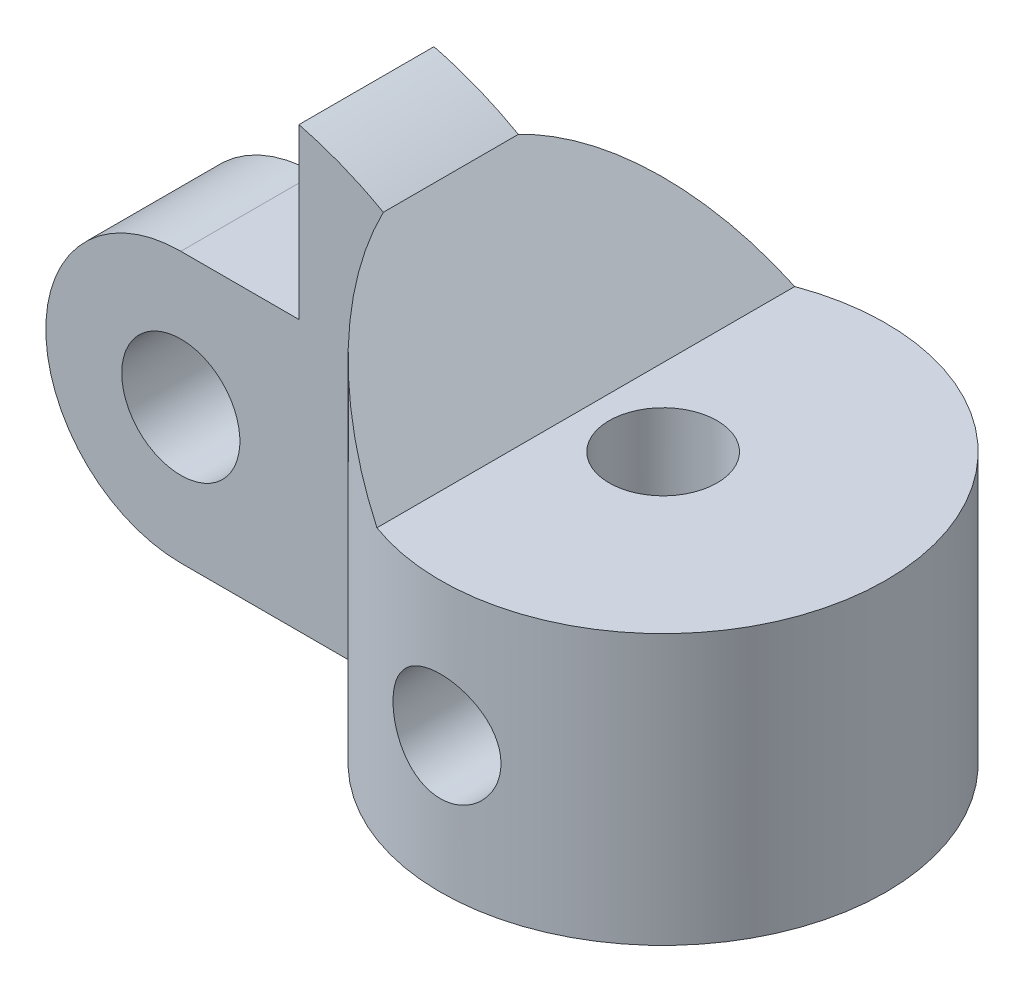
ISO-10303-21;
HEADER;
FILE_DESCRIPTION(('STEP AP214'),'2;1');
FILE_NAME('part.step','',(''),(''),'','','');
FILE_SCHEMA(('AUTOMOTIVE_DESIGN { 1 0 10303 214 1 1 1 1 }'));
ENDSEC;
DATA;
#1=APPLICATION_CONTEXT('core data for automotive mechanical design processes');
#2=APPLICATION_PROTOCOL_DEFINITION('international standard','automotive_design',2000,#1);
#3=PRODUCT_CONTEXT('',#1,'mechanical');
#4=PRODUCT('Part','Part','',(#3));
#5=PRODUCT_RELATED_PRODUCT_CATEGORY('part','',(#4));
#6=PRODUCT_DEFINITION_FORMATION('','',#4);
#7=PRODUCT_DEFINITION_CONTEXT('part definition',#1,'design');
#8=PRODUCT_DEFINITION('design','',#6,#7);
#9=PRODUCT_DEFINITION_SHAPE('','',#8);
#10=(LENGTH_UNIT() NAMED_UNIT(*) SI_UNIT(.MILLI.,.METRE.));
#11=(NAMED_UNIT(*) PLANE_ANGLE_UNIT() SI_UNIT($,.RADIAN.));
#12=(NAMED_UNIT(*) SI_UNIT($,.STERADIAN.) SOLID_ANGLE_UNIT());
#13=UNCERTAINTY_MEASURE_WITH_UNIT(LENGTH_MEASURE(1.E-05),#10,'distance_accuracy_value','');
#14=(GEOMETRIC_REPRESENTATION_CONTEXT(3) GLOBAL_UNCERTAINTY_ASSIGNED_CONTEXT((#13)) GLOBAL_UNIT_ASSIGNED_CONTEXT((#10,
#11,#12)) REPRESENTATION_CONTEXT('',''));
#15=CARTESIAN_POINT('',(0.,0.,0.));
#16=DIRECTION('',(0.,0.,1.));
#17=DIRECTION('',(1.,0.,0.));
#18=AXIS2_PLACEMENT_3D('',#15,#16,#17);
#19=CARTESIAN_POINT('',(0.,8.,0.));
#20=DIRECTION('',(0.,1.,0.));
#21=DIRECTION('',(0.,0.,-1.));
#22=AXIS2_PLACEMENT_3D('',#19,#20,#21);
#23=PLANE('',#22);
#24=DIRECTION('',(1.,0.,0.));
#25=VECTOR('',#24,1.);
#26=CARTESIAN_POINT('',(0.,8.,-2.));
#27=LINE('',#26,#25);
#28=CARTESIAN_POINT('',(-12.2896740774066,8.,-2.));
#29=VERTEX_POINT('',#28);
#30=CARTESIAN_POINT('',(-8.78967407740655,8.,-2.));
#31=VERTEX_POINT('',#30);
#32=EDGE_CURVE('E145',#29,#31,#27,.T.);
#33=ORIENTED_EDGE('',*,*,#32,.F.);
#34=DIRECTION('',(0.,0.,-1.));
#35=VECTOR('',#34,1.);
#36=CARTESIAN_POINT('',(-12.2896740774066,8.,6.6));
#37=LINE('',#36,#35);
#38=CARTESIAN_POINT('',(-12.2896740774066,8.,2.));
#39=VERTEX_POINT('',#38);
#40=EDGE_CURVE('E185',#39,#29,#37,.T.);
#41=ORIENTED_EDGE('',*,*,#40,.F.);
#42=DIRECTION('',(1.,0.,0.));
#43=VECTOR('',#42,1.);
#44=CARTESIAN_POINT('',(0.,8.,2.));
#45=LINE('',#44,#43);
#46=CARTESIAN_POINT('',(-8.78967407740655,8.,2.));
#47=VERTEX_POINT('',#46);
#48=EDGE_CURVE('E262',#39,#47,#45,.T.);
#49=ORIENTED_EDGE('',*,*,#48,.T.);
#50=DIRECTION('',(0.,0.,-1.));
#51=VECTOR('',#50,1.);
#52=CARTESIAN_POINT('',(-8.78967407740655,8.,2.));
#53=LINE('',#52,#51);
#54=EDGE_CURVE('E132',#47,#31,#53,.T.);
#55=ORIENTED_EDGE('',*,*,#54,.T.);
#56=EDGE_LOOP('',(#33,#41,#49,#55));
#57=FACE_BOUND('',#56,.T.);
#58=ADVANCED_FACE('F46',(#57),#23,.T.);
#59=CARTESIAN_POINT('',(0.,8.,0.));
#60=DIRECTION('',(0.,-1.,0.));
#61=DIRECTION('',(0.,0.,-1.));
#62=AXIS2_PLACEMENT_3D('',#59,#60,#61);
#63=CIRCLE('',#62,1.6);
#64=CARTESIAN_POINT('',(0.,8.,-1.6));
#65=VERTEX_POINT('',#64);
#66=EDGE_CURVE('E253',#65,#65,#63,.T.);
#67=ORIENTED_EDGE('',*,*,#66,.T.);
#68=EDGE_LOOP('',(#67));
#69=FACE_BOUND('',#68,.T.);
#70=CARTESIAN_POINT('',(0.,8.,0.));
#71=DIRECTION('',(0.,-1.,0.));
#72=DIRECTION('',(0.,0.,-1.));
#73=AXIS2_PLACEMENT_3D('',#70,#71,#72);
#74=CIRCLE('',#73,6.6);
#75=CARTESIAN_POINT('',(-2.28967407740657,8.,-6.19010441101379));
#76=VERTEX_POINT('',#75);
#77=CARTESIAN_POINT('',(-2.28967407740657,8.,6.19010441101379));
#78=VERTEX_POINT('',#77);
#79=EDGE_CURVE('E265',#76,#78,#74,.T.);
#80=ORIENTED_EDGE('',*,*,#79,.F.);
#81=DIRECTION('',(0.,0.,-1.));
#82=VECTOR('',#81,1.);
#83=CARTESIAN_POINT('',(-2.28967407740657,8.,0.));
#84=LINE('',#83,#82);
#85=EDGE_CURVE('E198',#78,#76,#84,.T.);
#86=ORIENTED_EDGE('',*,*,#85,.F.);
#87=EDGE_LOOP('',(#80,#86));
#88=FACE_BOUND('',#87,.T.);
#89=ADVANCED_FACE('F221',(#69,#88),#23,.T.);
#90=CARTESIAN_POINT('',(0.,8.,2.));
#91=DIRECTION('',(0.,0.,1.));
#92=DIRECTION('',(-1.,0.,0.));
#93=AXIS2_PLACEMENT_3D('',#90,#91,#92);
#94=PLANE('',#93);
#95=CARTESIAN_POINT('',(-12.2896740774066,4.,2.));
#96=DIRECTION('',(0.,0.,-1.));
#97=DIRECTION('',(-1.,0.,0.));
#98=AXIS2_PLACEMENT_3D('',#95,#96,#97);
#99=CIRCLE('',#98,1.75);
#100=CARTESIAN_POINT('',(-14.0396740774066,4.,2.));
#101=VERTEX_POINT('',#100);
#102=EDGE_CURVE('E239',#101,#101,#99,.T.);
#103=ORIENTED_EDGE('',*,*,#102,.T.);
#104=EDGE_LOOP('',(#103));
#105=FACE_BOUND('',#104,.T.);
#106=DIRECTION('',(0.,-1.,0.));
#107=VECTOR('',#106,1.);
#108=CARTESIAN_POINT('',(-8.78967407740655,13.,2.));
#109=LINE('',#108,#107);
#110=CARTESIAN_POINT('',(-8.78967407740655,13.,2.));
#111=VERTEX_POINT('',#110);
#112=EDGE_CURVE('E129',#111,#47,#109,.T.);
#113=ORIENTED_EDGE('',*,*,#112,.T.);
#114=ORIENTED_EDGE('',*,*,#48,.F.);
#115=CARTESIAN_POINT('',(-12.2896740774066,4.,2.));
#116=DIRECTION('',(0.,0.,-1.));
#117=DIRECTION('',(-1.,0.,0.));
#118=AXIS2_PLACEMENT_3D('',#115,#116,#117);
#119=CIRCLE('',#118,4.);
#120=CARTESIAN_POINT('',(-12.2896740774066,0.,2.));
#121=VERTEX_POINT('',#120);
#122=EDGE_CURVE('E260',#121,#39,#119,.T.);
#123=ORIENTED_EDGE('',*,*,#122,.F.);
#124=DIRECTION('',(1.,0.,0.));
#125=VECTOR('',#124,1.);
#126=CARTESIAN_POINT('',(0.,0.,2.));
#127=LINE('',#126,#125);
#128=CARTESIAN_POINT('',(-6.28967407740656,0.,2.));
#129=VERTEX_POINT('',#128);
#130=EDGE_CURVE('E183',#121,#129,#127,.T.);
#131=ORIENTED_EDGE('',*,*,#130,.T.);
#132=DIRECTION('',(0.,-1.,0.));
#133=VECTOR('',#132,1.);
#134=CARTESIAN_POINT('',(-6.28967407740656,8.,2.));
#135=LINE('',#134,#133);
#136=CARTESIAN_POINT('',(-6.28967407740656,12.,2.));
#137=VERTEX_POINT('',#136);
#138=EDGE_CURVE('E179',#137,#129,#135,.T.);
#139=ORIENTED_EDGE('',*,*,#138,.F.);
#140=CARTESIAN_POINT('',(-8.78967407740655,13.,2.));
#141=CARTESIAN_POINT('',(-7.47174105913595,12.6698325456765,2.));
#142=CARTESIAN_POINT('',(-6.28967407740656,12.,2.));
#143=(BOUNDED_CURVE() B_SPLINE_CURVE(2,(#140,#141,#142),.UNSPECIFIED.,.F.,
.F.) B_SPLINE_CURVE_WITH_KNOTS((3,3),(0.,1.),
.UNSPECIFIED.) CURVE() GEOMETRIC_REPRESENTATION_ITEM() RATIONAL_B_SPLINE_CURVE((1.,
0.990896059130321,1.)) REPRESENTATION_ITEM(''));
#144=EDGE_CURVE('E60',#111,#137,#143,.T.);
#145=ORIENTED_EDGE('',*,*,#144,.F.);
#146=EDGE_LOOP('',(#113,#114,#123,#131,#139,#145));
#147=FACE_BOUND('',#146,.T.);
#148=ADVANCED_FACE('F180',(#105,#147),#94,.T.);
#149=CARTESIAN_POINT('',(0.,8.,-2.));
#150=DIRECTION('',(0.,0.,1.));
#151=DIRECTION('',(-1.,0.,0.));
#152=AXIS2_PLACEMENT_3D('',#149,#150,#151);
#153=PLANE('',#152);
#154=CARTESIAN_POINT('',(-12.2896740774066,4.,-2.));
#155=DIRECTION('',(0.,0.,-1.));
#156=DIRECTION('',(-1.,0.,0.));
#157=AXIS2_PLACEMENT_3D('',#154,#155,#156);
#158=CIRCLE('',#157,1.75);
#159=CARTESIAN_POINT('',(-14.0396740774066,4.,-2.));
#160=VERTEX_POINT('',#159);
#161=EDGE_CURVE('E236',#160,#160,#158,.T.);
#162=ORIENTED_EDGE('',*,*,#161,.F.);
#163=EDGE_LOOP('',(#162));
#164=FACE_BOUND('',#163,.T.);
#165=DIRECTION('',(0.,-1.,0.));
#166=VECTOR('',#165,1.);
#167=CARTESIAN_POINT('',(-6.28967407740656,8.,-2.));
#168=LINE('',#167,#166);
#169=CARTESIAN_POINT('',(-6.28967407740656,12.,-2.));
#170=VERTEX_POINT('',#169);
#171=CARTESIAN_POINT('',(-6.28967407740656,0.,-2.));
#172=VERTEX_POINT('',#171);
#173=EDGE_CURVE('E186',#170,#172,#168,.T.);
#174=ORIENTED_EDGE('',*,*,#173,.T.);
#175=DIRECTION('',(1.,0.,0.));
#176=VECTOR('',#175,1.);
#177=CARTESIAN_POINT('',(0.,0.,-2.));
#178=LINE('',#177,#176);
#179=CARTESIAN_POINT('',(-12.2896740774066,0.,-2.));
#180=VERTEX_POINT('',#179);
#181=EDGE_CURVE('E250',#180,#172,#178,.T.);
#182=ORIENTED_EDGE('',*,*,#181,.F.);
#183=CARTESIAN_POINT('',(-12.2896740774066,4.,-2.));
#184=DIRECTION('',(0.,0.,-1.));
#185=DIRECTION('',(-1.,0.,0.));
#186=AXIS2_PLACEMENT_3D('',#183,#184,#185);
#187=CIRCLE('',#186,4.);
#188=EDGE_CURVE('E271',#180,#29,#187,.T.);
#189=ORIENTED_EDGE('',*,*,#188,.T.);
#190=ORIENTED_EDGE('',*,*,#32,.T.);
#191=DIRECTION('',(0.,-1.,0.));
#192=VECTOR('',#191,1.);
#193=CARTESIAN_POINT('',(-8.78967407740655,13.,-2.));
#194=LINE('',#193,#192);
#195=CARTESIAN_POINT('',(-8.78967407740655,13.,-2.));
#196=VERTEX_POINT('',#195);
#197=EDGE_CURVE('E127',#196,#31,#194,.T.);
#198=ORIENTED_EDGE('',*,*,#197,.F.);
#199=CARTESIAN_POINT('',(-6.28967407740656,12.,-2.));
#200=CARTESIAN_POINT('',(-7.47174105913595,12.6698325456765,-2.));
#201=CARTESIAN_POINT('',(-8.78967407740656,13.,-2.));
#202=(BOUNDED_CURVE() B_SPLINE_CURVE(2,(#199,#200,#201),.UNSPECIFIED.,.F.,
.F.) B_SPLINE_CURVE_WITH_KNOTS((3,3),(0.,1.),
.UNSPECIFIED.) CURVE() GEOMETRIC_REPRESENTATION_ITEM() RATIONAL_B_SPLINE_CURVE((1.,
0.990896059130321,1.)) REPRESENTATION_ITEM(''));
#203=EDGE_CURVE('E12',#170,#196,#202,.T.);
#204=ORIENTED_EDGE('',*,*,#203,.F.);
#205=EDGE_LOOP('',(#174,#182,#189,#190,#198,#204));
#206=FACE_BOUND('',#205,.T.);
#207=ADVANCED_FACE('F143',(#164,#206),#153,.F.);
#208=CARTESIAN_POINT('',(0.,8.,0.));
#209=DIRECTION('',(0.,-1.,0.));
#210=DIRECTION('',(0.,0.,1.));
#211=AXIS2_PLACEMENT_3D('',#208,#209,#210);
#212=CYLINDRICAL_SURFACE('',#211,1.6);
#213=CARTESIAN_POINT('',(0.,4.,0.));
#214=DIRECTION('',(0.,0.707106781186547,0.707106781186547));
#215=DIRECTION('',(0.,-0.707106781186547,0.707106781186547));
#216=AXIS2_PLACEMENT_3D('',#213,#214,#215);
#217=ELLIPSE('',#216,2.26274169979695,1.6);
#218=CARTESIAN_POINT('',(-1.6,4.,0.));
#219=VERTEX_POINT('',#218);
#220=CARTESIAN_POINT('',(1.6,4.,0.));
#221=VERTEX_POINT('',#220);
#222=EDGE_CURVE('E240',#219,#221,#217,.F.);
#223=ORIENTED_EDGE('',*,*,#222,.T.);
#224=CARTESIAN_POINT('',(0.,4.,0.));
#225=DIRECTION('',(0.,0.707106781186547,-0.707106781186547));
#226=DIRECTION('',(0.,-0.707106781186547,-0.707106781186547));
#227=AXIS2_PLACEMENT_3D('',#224,#225,#226);
#228=ELLIPSE('',#227,2.26274169979695,1.6);
#229=EDGE_CURVE('E246',#221,#219,#228,.F.);
#230=ORIENTED_EDGE('',*,*,#229,.T.);
#231=EDGE_LOOP('',(#223,#230));
#232=FACE_BOUND('',#231,.T.);
#233=ORIENTED_EDGE('',*,*,#66,.F.);
#234=EDGE_LOOP('',(#233));
#235=FACE_BOUND('',#234,.T.);
#236=ADVANCED_FACE('F214',(#232,#235),#212,.F.);
#237=CARTESIAN_POINT('',(0.,0.,0.));
#238=DIRECTION('',(0.,1.,0.));
#239=DIRECTION('',(0.,0.,-1.));
#240=AXIS2_PLACEMENT_3D('',#237,#238,#239);
#241=PLANE('',#240);
#242=CARTESIAN_POINT('',(0.,0.,0.));
#243=DIRECTION('',(0.,-1.,0.));
#244=DIRECTION('',(0.,0.,-1.));
#245=AXIS2_PLACEMENT_3D('',#242,#243,#244);
#246=CIRCLE('',#245,1.6);
#247=CARTESIAN_POINT('',(0.,0.,-1.6));
#248=VERTEX_POINT('',#247);
#249=EDGE_CURVE('E257',#248,#248,#246,.T.);
#250=ORIENTED_EDGE('',*,*,#249,.F.);
#251=EDGE_LOOP('',(#250));
#252=FACE_BOUND('',#251,.T.);
#253=DIRECTION('',(0.,0.,-1.));
#254=VECTOR('',#253,1.);
#255=CARTESIAN_POINT('',(-12.2896740774066,0.,6.6));
#256=LINE('',#255,#254);
#257=EDGE_CURVE('E189',#121,#180,#256,.T.);
#258=ORIENTED_EDGE('',*,*,#257,.T.);
#259=ORIENTED_EDGE('',*,*,#181,.T.);
#260=CARTESIAN_POINT('',(0.,0.,0.));
#261=DIRECTION('',(0.,-1.,0.));
#262=DIRECTION('',(0.,0.,-1.));
#263=AXIS2_PLACEMENT_3D('',#260,#261,#262);
#264=CIRCLE('',#263,6.6);
#265=EDGE_CURVE('E255',#172,#129,#264,.T.);
#266=ORIENTED_EDGE('',*,*,#265,.T.);
#267=ORIENTED_EDGE('',*,*,#130,.F.);
#268=EDGE_LOOP('',(#258,#259,#266,#267));
#269=FACE_BOUND('',#268,.T.);
#270=ADVANCED_FACE('F216',(#252,#269),#241,.F.);
#271=CARTESIAN_POINT('',(0.,8.,0.));
#272=DIRECTION('',(0.,-1.,0.));
#273=DIRECTION('',(0.,0.,1.));
#274=AXIS2_PLACEMENT_3D('',#271,#272,#273);
#275=CYLINDRICAL_SURFACE('',#274,6.6);
#276=CARTESIAN_POINT('',(1.6,4.,6.40312423743285));
#277=CARTESIAN_POINT('',(1.59999733947836,4.08844402406098,6.40312597037609));
#278=CARTESIAN_POINT('',(1.59264157848281,4.17691809600071,6.40497670400888));
#279=CARTESIAN_POINT('',(1.56345601743318,4.35133182154082,6.4121621325328));
#280=CARTESIAN_POINT('',(1.54161728105349,4.43726987614424,6.41749897840401));
#281=CARTESIAN_POINT('',(1.48420900234039,4.60406355514517,6.43101748536075));
#282=CARTESIAN_POINT('',(1.44865650524925,4.68492534448298,6.43919561368331));
#283=CARTESIAN_POINT('',(1.3648810998873,4.83954379086885,6.45747086045777));
#284=CARTESIAN_POINT('',(1.31665785249965,4.91330025767959,6.46756803026843));
#285=CARTESIAN_POINT('',(1.20784389900135,5.05314159602282,6.48877758318028));
#286=CARTESIAN_POINT('',(1.14703929913897,5.11905772455782,6.49990538881894));
#287=CARTESIAN_POINT('',(1.01524965153105,5.23986289597431,6.5217882988137));
#288=CARTESIAN_POINT('',(0.944263695721746,5.29475095422509,6.53254336981968));
#289=CARTESIAN_POINT('',(0.792976530006599,5.39262652396975,6.55263898037571));
#290=CARTESIAN_POINT('',(0.71256570600993,5.43544913714583,6.56195919706409));
#291=CARTESIAN_POINT('',(0.545423893058168,5.50690743021361,6.57795945463852));
#292=CARTESIAN_POINT('',(0.458693781262912,5.53554507478769,6.58463986112431));
#293=CARTESIAN_POINT('',(0.28313343703087,5.57728248350463,6.59449878121048));
#294=CARTESIAN_POINT('',(0.194374956348101,5.59066857236418,6.59774174354862));
#295=CARTESIAN_POINT('',(0.0158168750524344,5.60242074593819,6.60058464260182));
#296=CARTESIAN_POINT('',(-0.0739825787233714,5.60078892390197,6.60018508702391));
#297=CARTESIAN_POINT('',(-0.25009076322241,5.5827593886002,6.59583627033507));
#298=CARTESIAN_POINT('',(-0.336433231377963,5.56667061845232,6.59196128200833));
#299=CARTESIAN_POINT('',(-0.505154519829912,5.52067938716169,6.58118299179282));
#300=CARTESIAN_POINT('',(-0.587533136198652,5.49077621614884,6.57427953428333));
#301=CARTESIAN_POINT('',(-0.74681326529544,5.41774922909505,6.55810487467464));
#302=CARTESIAN_POINT('',(-0.823661440791099,5.37451366657421,6.54881377443151));
#303=CARTESIAN_POINT('',(-0.969121094903154,5.27613357148008,6.52887450690487));
#304=CARTESIAN_POINT('',(-1.03773121476807,5.22098707855287,6.51822611635086));
#305=CARTESIAN_POINT('',(-1.16660863727456,5.09868762962085,6.49641521034034));
#306=CARTESIAN_POINT('',(-1.22661882104947,5.03126455163238,6.48524650824044));
#307=CARTESIAN_POINT('',(-1.33453585965573,4.88719490884861,6.46390352969242));
#308=CARTESIAN_POINT('',(-1.38244221584308,4.81054796424765,6.45372929422414));
#309=CARTESIAN_POINT('',(-1.46494322915083,4.64972470273884,6.43550637883586));
#310=CARTESIAN_POINT('',(-1.4994794029305,4.56551724795948,6.42746708453676));
#311=CARTESIAN_POINT('',(-1.55382718977604,4.39225039215391,6.41454673226991));
#312=CARTESIAN_POINT('',(-1.57364174189015,4.30319196339657,6.40966504393782));
#313=CARTESIAN_POINT('',(-1.59756435294379,4.12512682937485,6.40374402358904));
#314=CARTESIAN_POINT('',(-1.60205110778769,4.03617402039503,6.40261207062851));
#315=CARTESIAN_POINT('',(-1.59622462099622,3.85879092404816,6.40406713975094));
#316=CARTESIAN_POINT('',(-1.58591265192973,3.77036059240892,6.4066538420601));
#317=CARTESIAN_POINT('',(-1.55111264233716,3.59791634012609,6.41516633208495));
#318=CARTESIAN_POINT('',(-1.52684202876438,3.51385577255964,6.42104086992378));
#319=CARTESIAN_POINT('',(-1.46505330245464,3.35099563472862,6.43541907577093));
#320=CARTESIAN_POINT('',(-1.427533693674,3.27219665978537,6.44392304067414));
#321=CARTESIAN_POINT('',(-1.33950890361332,3.12048324751841,6.46279907110407));
#322=CARTESIAN_POINT('',(-1.28877556385843,3.04770522515797,6.47320288866304));
#323=CARTESIAN_POINT('',(-1.176054449739,2.91155642689974,6.49462703788132));
#324=CARTESIAN_POINT('',(-1.11406494115952,2.84818710331931,6.50564746435902));
#325=CARTESIAN_POINT('',(-0.978859243852804,2.73113684816081,6.52737484171816));
#326=CARTESIAN_POINT('',(-0.905414542587484,2.67771694544761,6.5380684476914));
#327=CARTESIAN_POINT('',(-0.750376177663217,2.58397023624514,6.55766967940658));
#328=CARTESIAN_POINT('',(-0.668782931491631,2.54364275942034,6.56657739657757));
#329=CARTESIAN_POINT('',(-0.500317828978865,2.47756489223356,6.58154809251216));
#330=CARTESIAN_POINT('',(-0.413487967421985,2.45171216041208,6.58763099011155));
#331=CARTESIAN_POINT('',(-0.236550277056997,2.41500676666825,6.59635362322054));
#332=CARTESIAN_POINT('',(-0.146443043735652,2.40415139361489,6.5989939810466));
#333=CARTESIAN_POINT('',(0.0320330834287471,2.39789370197624,6.60051038370048));
#334=CARTESIAN_POINT('',(0.120387845166776,2.4021050810357,6.59948053308083));
#335=CARTESIAN_POINT('',(0.295090603727327,2.42498180031035,6.59397912156365));
#336=CARTESIAN_POINT('',(0.381438653778092,2.44364675669111,6.58950765206303));
#337=CARTESIAN_POINT('',(0.549299070646439,2.49469887896567,6.57763810488231));
#338=CARTESIAN_POINT('',(0.630832598167391,2.52701996018495,6.57025413266408));
#339=CARTESIAN_POINT('',(0.787364816025318,2.60440616156891,6.55333973860274));
#340=CARTESIAN_POINT('',(0.862362725594601,2.64947280163974,6.54380906079289));
#341=CARTESIAN_POINT('',(1.00554031833552,2.75226967813651,6.52336129617945));
#342=CARTESIAN_POINT('',(1.07352623332947,2.81026451788978,6.51241761643753));
#343=CARTESIAN_POINT('',(1.19893242972994,2.93675265363601,6.49050250288316));
#344=CARTESIAN_POINT('',(1.25635006733463,3.00524856878544,6.47953106282008));
#345=CARTESIAN_POINT('',(1.35995880768537,3.15221778456658,6.45858815699281));
#346=CARTESIAN_POINT('',(1.40593901379458,3.23084290180638,6.448637221504));
#347=CARTESIAN_POINT('',(1.48395977964431,3.39493550764195,6.43113315660768));
#348=CARTESIAN_POINT('',(1.51601091235572,3.48039774791219,6.42357820968792));
#349=CARTESIAN_POINT('',(1.56024691692113,3.63814570603387,6.41295817096726));
#350=CARTESIAN_POINT('',(1.57512286070378,3.70964864102359,6.40929733413103));
#351=CARTESIAN_POINT('',(1.59500013121856,3.85409430607224,6.40437974225737));
#352=CARTESIAN_POINT('',(1.60000219483265,3.92703692827776,6.40312280781832));
#353=CARTESIAN_POINT('',(1.6,4.,6.40312423743285));
#354=B_SPLINE_CURVE_WITH_KNOTS('',3,(#276,#277,#278,#279,#280,#281,#282,#283,#284,#285,#286,
#287,#288,#289,#290,#291,#292,#293,#294,#295,#296,#297,#298,#299,#300,#301,#302,#303,#304,#305,
#306,#307,#308,#309,#310,#311,#312,#313,#314,#315,#316,#317,#318,#319,#320,#321,#322,#323,#324,
#325,#326,#327,#328,#329,#330,#331,#332,#333,#334,#335,#336,#337,#338,#339,#340,#341,#342,#343,
#344,#345,#346,#347,#348,#349,#350,#351,#352,#353),.UNSPECIFIED.,.T.,.F.,(4,2,2,2,2,2,2,2,2,2,2,
2,2,2,2,2,2,2,2,2,2,2,2,2,2,2,2,2,2,2,2,2,2,2,2,2,2,2,4),(0.,0.265064273258436,
0.530292249566571,0.795191622869191,1.0600980865956,1.32994540119492,1.59981679815771,
1.87321504847942,2.14657542130955,2.41471463941518,2.68281648389817,2.94532180998148,
3.20784062672676,3.47262248908861,3.73744796368044,4.00902119378664,4.28060561013037,
4.55336490852977,4.82606973818098,5.09198626575298,5.35787992805489,5.619739930883,
5.88162951175322,6.1483813618781,6.41517434484027,6.68820231251325,6.96121629887957,
7.23227478485269,7.50328426411234,7.76739558504667,8.03149989238554,8.29434052625653,
8.55721251706291,8.82606066778539,9.09497598347789,9.36853321512672,9.64188243681685,
9.86056704862862,10.0792353395176),.UNSPECIFIED.);
#355=CARTESIAN_POINT('',(1.6,4.,6.40312423743285));
#356=VERTEX_POINT('',#355);
#357=EDGE_CURVE('E149',#356,#356,#354,.T.);
#358=ORIENTED_EDGE('',*,*,#357,.F.);
#359=EDGE_LOOP('',(#358));
#360=FACE_BOUND('',#359,.T.);
#361=CARTESIAN_POINT('',(1.6,4.,-6.40312423743285));
#362=CARTESIAN_POINT('',(1.59999733947836,3.91155597593902,-6.40312597037609));
#363=CARTESIAN_POINT('',(1.59264157848281,3.82308190399929,-6.40497670400888));
#364=CARTESIAN_POINT('',(1.56345601743318,3.64866817845918,-6.4121621325328));
#365=CARTESIAN_POINT('',(1.54161728105349,3.56273012385576,-6.41749897840401));
#366=CARTESIAN_POINT('',(1.48420900234039,3.39593644485483,-6.43101748536075));
#367=CARTESIAN_POINT('',(1.44865650524925,3.31507465551702,-6.43919561368331));
#368=CARTESIAN_POINT('',(1.3648810998873,3.16045620913115,-6.45747086045777));
#369=CARTESIAN_POINT('',(1.31665785249964,3.08669974232041,-6.46756803026843));
#370=CARTESIAN_POINT('',(1.20784389900135,2.94685840397718,-6.48877758318028));
#371=CARTESIAN_POINT('',(1.14703929913897,2.88094227544218,-6.49990538881894));
#372=CARTESIAN_POINT('',(1.01524965153105,2.76013710402569,-6.5217882988137));
#373=CARTESIAN_POINT('',(0.944263695721746,2.70524904577491,-6.53254336981968));
#374=CARTESIAN_POINT('',(0.792976530006598,2.60737347603025,-6.55263898037571));
#375=CARTESIAN_POINT('',(0.712565706009929,2.56455086285417,-6.56195919706409));
#376=CARTESIAN_POINT('',(0.545423893058167,2.49309256978639,-6.57795945463852));
#377=CARTESIAN_POINT('',(0.458693781262911,2.46445492521231,-6.58463986112431));
#378=CARTESIAN_POINT('',(0.283133437030869,2.42271751649537,-6.59449878121048));
#379=CARTESIAN_POINT('',(0.1943749563481,2.40933142763582,-6.59774174354862));
#380=CARTESIAN_POINT('',(0.015816875052433,2.39757925406181,-6.60058464260182));
#381=CARTESIAN_POINT('',(-0.0739825787233729,2.39921107609803,-6.60018508702391));
#382=CARTESIAN_POINT('',(-0.250090763222411,2.4172406113998,-6.59583627033507));
#383=CARTESIAN_POINT('',(-0.336433231377964,2.43332938154768,-6.59196128200833));
#384=CARTESIAN_POINT('',(-0.505154519829913,2.47932061283831,-6.58118299179282));
#385=CARTESIAN_POINT('',(-0.587533136198653,2.50922378385116,-6.57427953428333));
#386=CARTESIAN_POINT('',(-0.746813265295442,2.58225077090495,-6.55810487467464));
#387=CARTESIAN_POINT('',(-0.823661440791101,2.62548633342579,-6.54881377443151));
#388=CARTESIAN_POINT('',(-0.969121094903155,2.72386642851992,-6.52887450690487));
#389=CARTESIAN_POINT('',(-1.03773121476807,2.77901292144713,-6.51822611635086));
#390=CARTESIAN_POINT('',(-1.16660863727457,2.90131237037916,-6.49641521034034));
#391=CARTESIAN_POINT('',(-1.22661882104947,2.96873544836762,-6.48524650824044));
#392=CARTESIAN_POINT('',(-1.33453585965573,3.11280509115139,-6.46390352969242));
#393=CARTESIAN_POINT('',(-1.38244221584308,3.18945203575236,-6.45372929422414));
#394=CARTESIAN_POINT('',(-1.46494322915083,3.35027529726117,-6.43550637883586));
#395=CARTESIAN_POINT('',(-1.4994794029305,3.43448275204052,-6.42746708453676));
#396=CARTESIAN_POINT('',(-1.55382718977604,3.60774960784609,-6.41454673226991));
#397=CARTESIAN_POINT('',(-1.57364174189015,3.69680803660343,-6.40966504393782));
#398=CARTESIAN_POINT('',(-1.59756435294379,3.87487317062515,-6.40374402358904));
#399=CARTESIAN_POINT('',(-1.60205110778769,3.96382597960497,-6.40261207062851));
#400=CARTESIAN_POINT('',(-1.59622462099622,4.14120907595185,-6.40406713975094));
#401=CARTESIAN_POINT('',(-1.58591265192973,4.22963940759109,-6.4066538420601));
#402=CARTESIAN_POINT('',(-1.55111264233716,4.40208365987391,-6.41516633208495));
#403=CARTESIAN_POINT('',(-1.52684202876438,4.48614422744036,-6.42104086992378));
#404=CARTESIAN_POINT('',(-1.46505330245464,4.64900436527138,-6.43541907577093));
#405=CARTESIAN_POINT('',(-1.427533693674,4.72780334021463,-6.44392304067414));
#406=CARTESIAN_POINT('',(-1.33950890361332,4.87951675248159,-6.46279907110407));
#407=CARTESIAN_POINT('',(-1.28877556385843,4.95229477484203,-6.47320288866304));
#408=CARTESIAN_POINT('',(-1.176054449739,5.08844357310027,-6.49462703788132));
#409=CARTESIAN_POINT('',(-1.11406494115952,5.15181289668069,-6.50564746435903));
#410=CARTESIAN_POINT('',(-0.978859243852802,5.2688631518392,-6.52737484171817));
#411=CARTESIAN_POINT('',(-0.905414542587482,5.3222830545524,-6.5380684476914));
#412=CARTESIAN_POINT('',(-0.750376177663215,5.41602976375486,-6.55766967940658));
#413=CARTESIAN_POINT('',(-0.668782931491629,5.45635724057966,-6.56657739657757));
#414=CARTESIAN_POINT('',(-0.500317828978863,5.52243510776645,-6.58154809251216));
#415=CARTESIAN_POINT('',(-0.413487967421983,5.54828783958792,-6.58763099011155));
#416=CARTESIAN_POINT('',(-0.236550277056996,5.58499323333175,-6.59635362322054));
#417=CARTESIAN_POINT('',(-0.14644304373565,5.59584860638511,-6.5989939810466));
#418=CARTESIAN_POINT('',(0.0320330834287485,5.60210629802376,-6.60051038370048));
#419=CARTESIAN_POINT('',(0.120387845166777,5.5978949189643,-6.59948053308083));
#420=CARTESIAN_POINT('',(0.295090603727328,5.57501819968965,-6.59397912156365));
#421=CARTESIAN_POINT('',(0.381438653778093,5.55635324330889,-6.58950765206303));
#422=CARTESIAN_POINT('',(0.549299070646441,5.50530112103433,-6.57763810488231));
#423=CARTESIAN_POINT('',(0.630832598167394,5.47298003981505,-6.57025413266408));
#424=CARTESIAN_POINT('',(0.787364816025321,5.39559383843109,-6.55333973860274));
#425=CARTESIAN_POINT('',(0.862362725594603,5.35052719836026,-6.54380906079289));
#426=CARTESIAN_POINT('',(1.00554031833552,5.24773032186349,-6.52336129617945));
#427=CARTESIAN_POINT('',(1.07352623332948,5.18973548211022,-6.51241761643753));
#428=CARTESIAN_POINT('',(1.19893242972994,5.06324734636399,-6.49050250288316));
#429=CARTESIAN_POINT('',(1.25635006733463,4.99475143121456,-6.47953106282008));
#430=CARTESIAN_POINT('',(1.35995880768537,4.84778221543341,-6.45858815699281));
#431=CARTESIAN_POINT('',(1.40593901379458,4.76915709819362,-6.448637221504));
#432=CARTESIAN_POINT('',(1.48395977964431,4.60506449235805,-6.43113315660768));
#433=CARTESIAN_POINT('',(1.51601091235572,4.51960225208781,-6.42357820968792));
#434=CARTESIAN_POINT('',(1.56024691692113,4.36185429396613,-6.41295817096726));
#435=CARTESIAN_POINT('',(1.57512286070378,4.29035135897641,-6.40929733413103));
#436=CARTESIAN_POINT('',(1.59500013121856,4.14590569392776,-6.40437974225737));
#437=CARTESIAN_POINT('',(1.60000219483265,4.07296307172224,-6.40312280781832));
#438=CARTESIAN_POINT('',(1.6,4.,-6.40312423743285));
#439=B_SPLINE_CURVE_WITH_KNOTS('',3,(#361,#362,#363,#364,#365,#366,#367,#368,#369,#370,#371,
#372,#373,#374,#375,#376,#377,#378,#379,#380,#381,#382,#383,#384,#385,#386,#387,#388,#389,#390,
#391,#392,#393,#394,#395,#396,#397,#398,#399,#400,#401,#402,#403,#404,#405,#406,#407,#408,#409,
#410,#411,#412,#413,#414,#415,#416,#417,#418,#419,#420,#421,#422,#423,#424,#425,#426,#427,#428,
#429,#430,#431,#432,#433,#434,#435,#436,#437,#438),.UNSPECIFIED.,.T.,.F.,(4,2,2,2,2,2,2,2,2,2,2,
2,2,2,2,2,2,2,2,2,2,2,2,2,2,2,2,2,2,2,2,2,2,2,2,2,2,2,4),(0.,0.265064273258436,
0.530292249566571,0.795191622869193,1.0600980865956,1.32994540119492,1.59981679815771,
1.87321504847942,2.14657542130956,2.41471463941518,2.68281648389817,2.94532180998148,
3.20784062672676,3.47262248908861,3.73744796368044,4.00902119378665,4.28060561013037,
4.55336490852977,4.82606973818099,5.09198626575298,5.3578799280549,5.619739930883,
5.88162951175322,6.1483813618781,6.41517434484028,6.68820231251325,6.96121629887958,
7.23227478485269,7.50328426411234,7.76739558504667,8.03149989238554,8.29434052625654,
8.55721251706292,8.82606066778539,9.09497598347789,9.36853321512673,9.64188243681686,
9.86056704862863,10.0792353395176),.UNSPECIFIED.);
#440=CARTESIAN_POINT('',(1.6,4.,-6.40312423743285));
#441=VERTEX_POINT('',#440);
#442=EDGE_CURVE('E146',#441,#441,#439,.T.);
#443=ORIENTED_EDGE('',*,*,#442,.F.);
#444=EDGE_LOOP('',(#443));
#445=FACE_BOUND('',#444,.T.);
#446=ORIENTED_EDGE('',*,*,#265,.F.);
#447=ORIENTED_EDGE('',*,*,#173,.F.);
#448=CARTESIAN_POINT('',(0.,5.7103259225934,0.));
#449=DIRECTION('',(0.707106781186551,0.707106781186544,0.));
#450=DIRECTION('',(0.707106781186544,-0.707106781186551,0.));
#451=AXIS2_PLACEMENT_3D('',#448,#449,#450);
#452=ELLIPSE('',#451,9.33380951166248,6.6);
#453=EDGE_CURVE('E176',#76,#170,#452,.T.);
#454=ORIENTED_EDGE('',*,*,#453,.F.);
#455=ORIENTED_EDGE('',*,*,#79,.T.);
#456=CARTESIAN_POINT('',(0.,5.7103259225934,0.));
#457=DIRECTION('',(0.707106781186551,0.707106781186544,0.));
#458=DIRECTION('',(0.707106781186544,-0.707106781186551,0.));
#459=AXIS2_PLACEMENT_3D('',#456,#457,#458);
#460=ELLIPSE('',#459,9.33380951166248,6.6);
#461=EDGE_CURVE('E75',#137,#78,#460,.T.);
#462=ORIENTED_EDGE('',*,*,#461,.F.);
#463=ORIENTED_EDGE('',*,*,#138,.T.);
#464=EDGE_LOOP('',(#446,#447,#454,#455,#462,#463));
#465=FACE_BOUND('',#464,.T.);
#466=ADVANCED_FACE('F223',(#360,#445,#465),#275,.T.);
#467=CARTESIAN_POINT('',(0.,4.,0.));
#468=DIRECTION('',(0.,0.707106781186547,0.707106781186547));
#469=DIRECTION('',(0.,-0.707106781186547,0.707106781186547));
#470=AXIS2_PLACEMENT_3D('',#467,#468,#469);
#471=ELLIPSE('',#470,2.26274169979695,1.6);
#472=EDGE_CURVE('E243',#219,#221,#471,.T.);
#473=ORIENTED_EDGE('',*,*,#472,.T.);
#474=CARTESIAN_POINT('',(0.,4.,0.));
#475=DIRECTION('',(0.,0.707106781186547,-0.707106781186547));
#476=DIRECTION('',(0.,-0.707106781186547,-0.707106781186547));
#477=AXIS2_PLACEMENT_3D('',#474,#475,#476);
#478=ELLIPSE('',#477,2.26274169979695,1.6);
#479=EDGE_CURVE('E88',#221,#219,#478,.T.);
#480=ORIENTED_EDGE('',*,*,#479,.T.);
#481=EDGE_LOOP('',(#473,#480));
#482=FACE_BOUND('',#481,.T.);
#483=ORIENTED_EDGE('',*,*,#249,.T.);
#484=EDGE_LOOP('',(#483));
#485=FACE_BOUND('',#484,.T.);
#486=ADVANCED_FACE('F295',(#482,#485),#212,.F.);
#487=CARTESIAN_POINT('',(-12.2896740774066,4.,6.6));
#488=DIRECTION('',(0.,0.,-1.));
#489=DIRECTION('',(1.,0.,0.));
#490=AXIS2_PLACEMENT_3D('',#487,#488,#489);
#491=CYLINDRICAL_SURFACE('',#490,4.);
#492=ORIENTED_EDGE('',*,*,#122,.T.);
#493=ORIENTED_EDGE('',*,*,#40,.T.);
#494=ORIENTED_EDGE('',*,*,#188,.F.);
#495=ORIENTED_EDGE('',*,*,#257,.F.);
#496=EDGE_LOOP('',(#492,#493,#494,#495));
#497=FACE_BOUND('',#496,.T.);
#498=ADVANCED_FACE('F290',(#497),#491,.T.);
#499=CARTESIAN_POINT('',(0.,4.,6.6));
#500=DIRECTION('',(0.,0.,-1.));
#501=DIRECTION('',(1.,0.,0.));
#502=AXIS2_PLACEMENT_3D('',#499,#500,#501);
#503=CYLINDRICAL_SURFACE('',#502,1.6);
#504=ORIENTED_EDGE('',*,*,#472,.F.);
#505=ORIENTED_EDGE('',*,*,#229,.F.);
#506=EDGE_LOOP('',(#504,#505));
#507=FACE_BOUND('',#506,.T.);
#508=ORIENTED_EDGE('',*,*,#357,.T.);
#509=EDGE_LOOP('',(#508));
#510=FACE_BOUND('',#509,.T.);
#511=ADVANCED_FACE('F284',(#507,#510),#503,.F.);
#512=ORIENTED_EDGE('',*,*,#222,.F.);
#513=ORIENTED_EDGE('',*,*,#479,.F.);
#514=EDGE_LOOP('',(#512,#513));
#515=FACE_BOUND('',#514,.T.);
#516=ORIENTED_EDGE('',*,*,#442,.T.);
#517=EDGE_LOOP('',(#516));
#518=FACE_BOUND('',#517,.T.);
#519=ADVANCED_FACE('F289',(#515,#518),#503,.F.);
#520=CARTESIAN_POINT('',(-12.2896740774066,4.,6.6));
#521=DIRECTION('',(0.,0.,-1.));
#522=DIRECTION('',(1.,0.,0.));
#523=AXIS2_PLACEMENT_3D('',#520,#521,#522);
#524=CYLINDRICAL_SURFACE('',#523,1.75);
#525=ORIENTED_EDGE('',*,*,#102,.F.);
#526=EDGE_LOOP('',(#525));
#527=FACE_BOUND('',#526,.T.);
#528=ORIENTED_EDGE('',*,*,#161,.T.);
#529=EDGE_LOOP('',(#528));
#530=FACE_BOUND('',#529,.T.);
#531=ADVANCED_FACE('F292',(#527,#530),#524,.F.);
#532=CARTESIAN_POINT('',(-8.78967407740655,13.,2.));
#533=DIRECTION('',(1.,0.,0.));
#534=DIRECTION('',(0.,0.,1.));
#535=AXIS2_PLACEMENT_3D('',#532,#533,#534);
#536=PLANE('',#535);
#537=ORIENTED_EDGE('',*,*,#54,.F.);
#538=ORIENTED_EDGE('',*,*,#112,.F.);
#539=CARTESIAN_POINT('',(-8.78967407740655,13.,-2.2));
#540=CARTESIAN_POINT('',(-8.78967407740655,13.,-0.733333333333336));
#541=CARTESIAN_POINT('',(-8.78967407740655,13.,0.733333333333332));
#542=CARTESIAN_POINT('',(-8.78967407740655,13.,2.2));
#543=(BOUNDED_CURVE() B_SPLINE_CURVE(3,(#539,#540,#541,#542),.UNSPECIFIED.,.F.,
.F.) B_SPLINE_CURVE_WITH_KNOTS((4,4),(-0.0042,0.0002),
.UNSPECIFIED.) CURVE() GEOMETRIC_REPRESENTATION_ITEM() RATIONAL_B_SPLINE_CURVE((1.,1.,1.,1.)) REPRESENTATION_ITEM(''));
#544=EDGE_CURVE('E123',#111,#196,#543,.F.);
#545=ORIENTED_EDGE('',*,*,#544,.T.);
#546=ORIENTED_EDGE('',*,*,#197,.T.);
#547=EDGE_LOOP('',(#537,#538,#545,#546));
#548=FACE_BOUND('',#547,.T.);
#549=ADVANCED_FACE('F125',(#548),#536,.F.);
#550=CARTESIAN_POINT('',(-6.28967407740656,12.,2.));
#551=DIRECTION('',(-0.707106781186551,-0.707106781186544,0.));
#552=DIRECTION('',(0.,0.,1.));
#553=AXIS2_PLACEMENT_3D('',#550,#551,#552);
#554=PLANE('',#553);
#555=ORIENTED_EDGE('',*,*,#453,.T.);
#556=CARTESIAN_POINT('',(-6.28967407740656,12.,2.2));
#557=CARTESIAN_POINT('',(-6.28967407740656,12.,0.733333333333332));
#558=CARTESIAN_POINT('',(-6.28967407740656,12.,-0.733333333333336));
#559=CARTESIAN_POINT('',(-6.28967407740656,12.,-2.2));
#560=(BOUNDED_CURVE() B_SPLINE_CURVE(3,(#556,#557,#558,#559),.UNSPECIFIED.,.F.,
.F.) B_SPLINE_CURVE_WITH_KNOTS((4,4),(-0.0042,0.0002),
.UNSPECIFIED.) CURVE() GEOMETRIC_REPRESENTATION_ITEM() RATIONAL_B_SPLINE_CURVE((1.,1.,1.,1.)) REPRESENTATION_ITEM(''));
#561=EDGE_CURVE('E66',#170,#137,#560,.F.);
#562=ORIENTED_EDGE('',*,*,#561,.T.);
#563=ORIENTED_EDGE('',*,*,#461,.T.);
#564=ORIENTED_EDGE('',*,*,#85,.T.);
#565=EDGE_LOOP('',(#555,#562,#563,#564));
#566=FACE_BOUND('',#565,.T.);
#567=ADVANCED_FACE('F309',(#566),#554,.F.);
#568=CARTESIAN_POINT('',(-8.78967407740655,13.,-2.2));
#569=CARTESIAN_POINT('',(-8.78967407740655,13.,-0.733333333333336));
#570=CARTESIAN_POINT('',(-8.78967407740655,13.,0.733333333333332));
#571=CARTESIAN_POINT('',(-8.78967407740655,13.,2.2));
#572=CARTESIAN_POINT('',(-7.47174105913595,12.6698325456765,-2.2));
#573=CARTESIAN_POINT('',(-7.47174105913595,12.6698325456765,-0.733333333333336));
#574=CARTESIAN_POINT('',(-7.47174105913595,12.6698325456765,0.733333333333332));
#575=CARTESIAN_POINT('',(-7.47174105913595,12.6698325456765,2.2));
#576=CARTESIAN_POINT('',(-6.28967407740656,12.,-2.2));
#577=CARTESIAN_POINT('',(-6.28967407740656,12.,-0.733333333333336));
#578=CARTESIAN_POINT('',(-6.28967407740656,12.,0.733333333333332));
#579=CARTESIAN_POINT('',(-6.28967407740656,12.,2.2));
#580=(BOUNDED_SURFACE() B_SPLINE_SURFACE(2,3,((#568,#569,#570,#571),(#572,#573,#574,#575),(#576,
#577,#578,#579)),.UNSPECIFIED.,.F.,.F.,.F.) B_SPLINE_SURFACE_WITH_KNOTS((3,3),(4,4),(0.,1.),
(-0.0042,0.0002),.UNSPECIFIED.) GEOMETRIC_REPRESENTATION_ITEM() RATIONAL_B_SPLINE_SURFACE(((1.,
1.,1.,1.),(0.990896059130321,0.990896059130321,0.990896059130321,0.990896059130321),(1.,1.,1.,1.))) REPRESENTATION_ITEM('') SURFACE());
#581=ORIENTED_EDGE('',*,*,#203,.T.);
#582=ORIENTED_EDGE('',*,*,#544,.F.);
#583=ORIENTED_EDGE('',*,*,#144,.T.);
#584=ORIENTED_EDGE('',*,*,#561,.F.);
#585=EDGE_LOOP('',(#581,#582,#583,#584));
#586=FACE_BOUND('',#585,.T.);
#587=ADVANCED_FACE('F48',(#586),#580,.F.);
#588=CLOSED_SHELL('',(#58,#89,#148,#207,#236,#270,#466,#486,#498,#511,#519,#531,#549,#567,#587));
#589=MANIFOLD_SOLID_BREP('B2',#588);
#590=ADVANCED_BREP_SHAPE_REPRESENTATION('',(#18,#589),#14);
#591=SHAPE_DEFINITION_REPRESENTATION(#9,#590);
ENDSEC;
END-ISO-10303-21;
